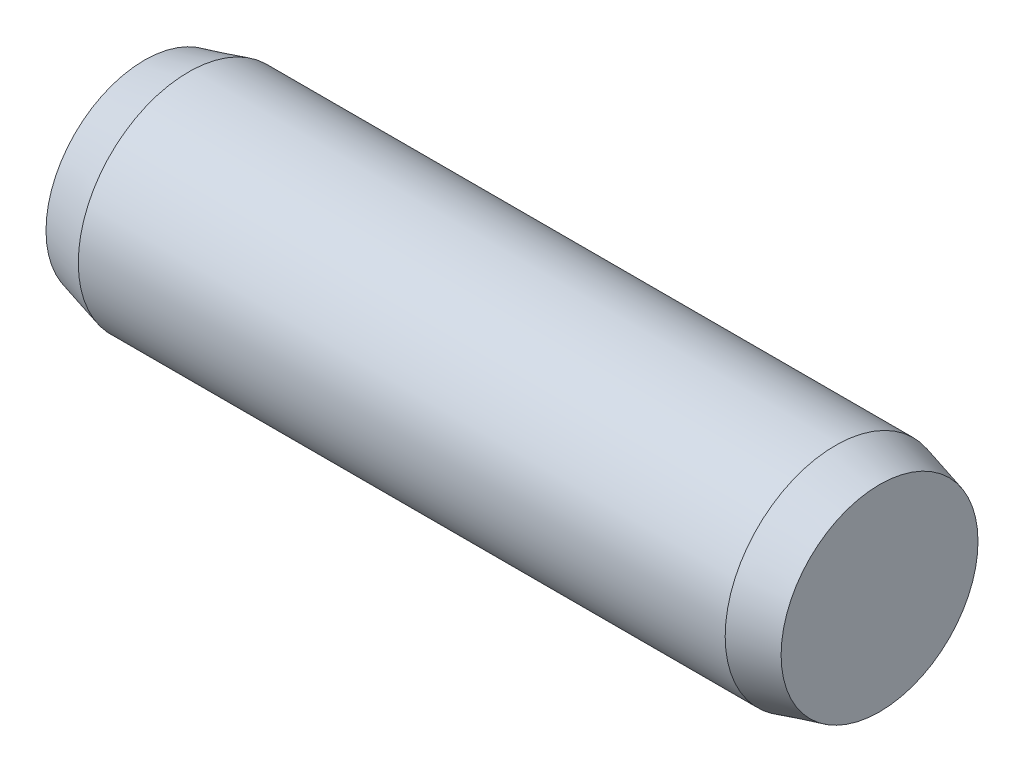
ISO-10303-21;
HEADER;
FILE_DESCRIPTION(('STEP AP214'),'2;1');
FILE_NAME('part.step','',(''),(''),'','','');
FILE_SCHEMA(('AUTOMOTIVE_DESIGN { 1 0 10303 214 1 1 1 1 }'));
ENDSEC;
DATA;
#1=APPLICATION_CONTEXT('core data for automotive mechanical design processes');
#2=APPLICATION_PROTOCOL_DEFINITION('international standard','automotive_design',2000,#1);
#3=PRODUCT_CONTEXT('',#1,'mechanical');
#4=PRODUCT('Part','Part','',(#3));
#5=PRODUCT_RELATED_PRODUCT_CATEGORY('part','',(#4));
#6=PRODUCT_DEFINITION_FORMATION('','',#4);
#7=PRODUCT_DEFINITION_CONTEXT('part definition',#1,'design');
#8=PRODUCT_DEFINITION('design','',#6,#7);
#9=PRODUCT_DEFINITION_SHAPE('','',#8);
#10=(LENGTH_UNIT() NAMED_UNIT(*) SI_UNIT(.MILLI.,.METRE.));
#11=(NAMED_UNIT(*) PLANE_ANGLE_UNIT() SI_UNIT($,.RADIAN.));
#12=(NAMED_UNIT(*) SI_UNIT($,.STERADIAN.) SOLID_ANGLE_UNIT());
#13=UNCERTAINTY_MEASURE_WITH_UNIT(LENGTH_MEASURE(1.E-05),#10,'distance_accuracy_value','');
#14=(GEOMETRIC_REPRESENTATION_CONTEXT(3) GLOBAL_UNCERTAINTY_ASSIGNED_CONTEXT((#13)) GLOBAL_UNIT_ASSIGNED_CONTEXT((#10,
#11,#12)) REPRESENTATION_CONTEXT('',''));
#15=CARTESIAN_POINT('',(0.,0.,0.));
#16=DIRECTION('',(0.,0.,1.));
#17=DIRECTION('',(1.,0.,0.));
#18=AXIS2_PLACEMENT_3D('',#15,#16,#17);
#19=CARTESIAN_POINT('',(0.,0.267846096908265,0.));
#20=DIRECTION('',(1.,0.,0.));
#21=DIRECTION('',(0.,0.,-1.));
#22=AXIS2_PLACEMENT_3D('',#19,#20,#21);
#23=PLANE('',#22);
#24=CARTESIAN_POINT('',(0.,0.,0.));
#25=DIRECTION('',(-1.,0.,0.));
#26=DIRECTION('',(0.,0.,1.));
#27=AXIS2_PLACEMENT_3D('',#24,#25,#26);
#28=CIRCLE('',#27,0.267846096908265);
#29=CARTESIAN_POINT('',(0.,0.,0.267846096908265));
#30=VERTEX_POINT('',#29);
#31=EDGE_CURVE('E45',#30,#30,#28,.T.);
#32=ORIENTED_EDGE('',*,*,#31,.T.);
#33=EDGE_LOOP('',(#32));
#34=FACE_BOUND('',#33,.T.);
#35=ADVANCED_FACE('F31',(#34),#23,.F.);
#36=CARTESIAN_POINT('',(2.,0.,0.));
#37=DIRECTION('',(-1.,0.,0.));
#38=DIRECTION('',(0.,0.,1.));
#39=AXIS2_PLACEMENT_3D('',#36,#37,#38);
#40=PLANE('',#39);
#41=CARTESIAN_POINT('',(2.,0.,0.));
#42=DIRECTION('',(-1.,0.,0.));
#43=DIRECTION('',(0.,0.,1.));
#44=AXIS2_PLACEMENT_3D('',#41,#42,#43);
#45=CIRCLE('',#44,0.267846096908265);
#46=CARTESIAN_POINT('',(2.,0.,0.267846096908265));
#47=VERTEX_POINT('',#46);
#48=EDGE_CURVE('E10',#47,#47,#45,.T.);
#49=ORIENTED_EDGE('',*,*,#48,.F.);
#50=EDGE_LOOP('',(#49));
#51=FACE_BOUND('',#50,.T.);
#52=ADVANCED_FACE('F65',(#51),#40,.F.);
#53=CARTESIAN_POINT('',(2.,0.,0.));
#54=DIRECTION('',(-1.,0.,0.));
#55=DIRECTION('',(0.,0.,1.));
#56=AXIS2_PLACEMENT_3D('',#53,#54,#55);
#57=CONICAL_SURFACE('',#56,0.267846096908265,0.26179938779915);
#58=CARTESIAN_POINT('',(1.88,0.,0.));
#59=DIRECTION('',(-1.,0.,0.));
#60=DIRECTION('',(0.,0.,1.));
#61=AXIS2_PLACEMENT_3D('',#58,#59,#60);
#62=CIRCLE('',#61,0.3);
#63=CARTESIAN_POINT('',(1.88,0.,0.3));
#64=VERTEX_POINT('',#63);
#65=EDGE_CURVE('E37',#64,#64,#62,.T.);
#66=ORIENTED_EDGE('',*,*,#65,.F.);
#67=EDGE_LOOP('',(#66));
#68=FACE_BOUND('',#67,.T.);
#69=ORIENTED_EDGE('',*,*,#48,.T.);
#70=EDGE_LOOP('',(#69));
#71=FACE_BOUND('',#70,.T.);
#72=ADVANCED_FACE('F60',(#68,#71),#57,.T.);
#73=CARTESIAN_POINT('',(-1.65571726559622,0.,0.));
#74=DIRECTION('',(-1.,0.,0.));
#75=DIRECTION('',(0.,0.,1.));
#76=AXIS2_PLACEMENT_3D('',#73,#74,#75);
#77=CYLINDRICAL_SURFACE('',#76,0.3);
#78=CARTESIAN_POINT('',(0.12,0.,0.));
#79=DIRECTION('',(-1.,0.,0.));
#80=DIRECTION('',(0.,0.,1.));
#81=AXIS2_PLACEMENT_3D('',#78,#79,#80);
#82=CIRCLE('',#81,0.3);
#83=CARTESIAN_POINT('',(0.12,0.,0.3));
#84=VERTEX_POINT('',#83);
#85=EDGE_CURVE('E41',#84,#84,#82,.T.);
#86=ORIENTED_EDGE('',*,*,#85,.F.);
#87=EDGE_LOOP('',(#86));
#88=FACE_BOUND('',#87,.T.);
#89=ORIENTED_EDGE('',*,*,#65,.T.);
#90=EDGE_LOOP('',(#89));
#91=FACE_BOUND('',#90,.T.);
#92=ADVANCED_FACE('F55',(#88,#91),#77,.T.);
#93=CARTESIAN_POINT('',(0.12,0.,0.));
#94=DIRECTION('',(1.,0.,0.));
#95=DIRECTION('',(0.,0.,-1.));
#96=AXIS2_PLACEMENT_3D('',#93,#94,#95);
#97=CONICAL_SURFACE('',#96,0.3,0.261799387799151);
#98=ORIENTED_EDGE('',*,*,#31,.F.);
#99=EDGE_LOOP('',(#98));
#100=FACE_BOUND('',#99,.T.);
#101=ORIENTED_EDGE('',*,*,#85,.T.);
#102=EDGE_LOOP('',(#101));
#103=FACE_BOUND('',#102,.T.);
#104=ADVANCED_FACE('F52',(#100,#103),#97,.T.);
#105=CLOSED_SHELL('',(#35,#52,#72,#92,#104));
#106=MANIFOLD_SOLID_BREP('B2',#105);
#107=ADVANCED_BREP_SHAPE_REPRESENTATION('',(#18,#106),#14);
#108=SHAPE_DEFINITION_REPRESENTATION(#9,#107);
ENDSEC;
END-ISO-10303-21;
